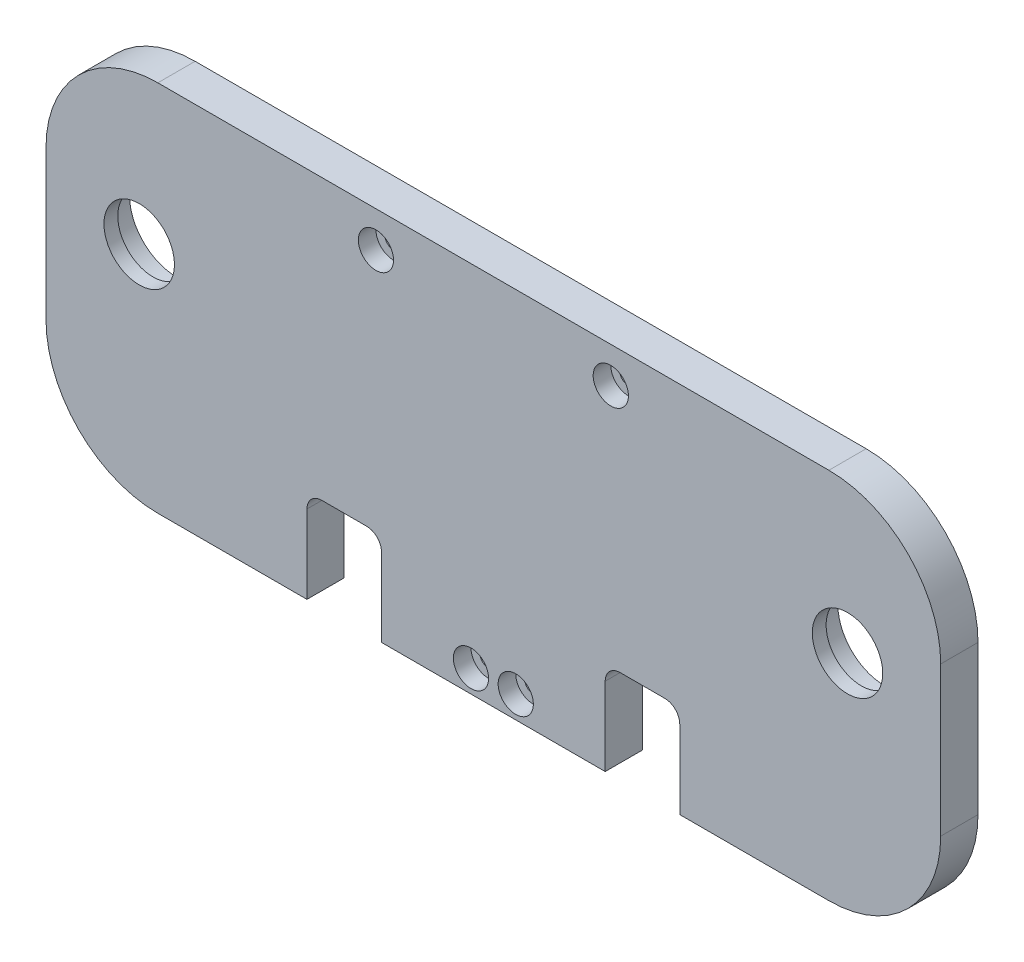
ISO-10303-21;
HEADER;
FILE_DESCRIPTION(('STEP AP214'),'2;1');
FILE_NAME('part.step','',(''),(''),'','','');
FILE_SCHEMA(('AUTOMOTIVE_DESIGN { 1 0 10303 214 1 1 1 1 }'));
ENDSEC;
DATA;
#1=APPLICATION_CONTEXT('core data for automotive mechanical design processes');
#2=APPLICATION_PROTOCOL_DEFINITION('international standard','automotive_design',2000,#1);
#3=PRODUCT_CONTEXT('',#1,'mechanical');
#4=PRODUCT('Part','Part','',(#3));
#5=PRODUCT_RELATED_PRODUCT_CATEGORY('part','',(#4));
#6=PRODUCT_DEFINITION_FORMATION('','',#4);
#7=PRODUCT_DEFINITION_CONTEXT('part definition',#1,'design');
#8=PRODUCT_DEFINITION('design','',#6,#7);
#9=PRODUCT_DEFINITION_SHAPE('','',#8);
#10=(LENGTH_UNIT() NAMED_UNIT(*) SI_UNIT(.MILLI.,.METRE.));
#11=(NAMED_UNIT(*) PLANE_ANGLE_UNIT() SI_UNIT($,.RADIAN.));
#12=(NAMED_UNIT(*) SI_UNIT($,.STERADIAN.) SOLID_ANGLE_UNIT());
#13=UNCERTAINTY_MEASURE_WITH_UNIT(LENGTH_MEASURE(1.E-05),#10,'distance_accuracy_value','');
#14=(GEOMETRIC_REPRESENTATION_CONTEXT(3) GLOBAL_UNCERTAINTY_ASSIGNED_CONTEXT((#13)) GLOBAL_UNIT_ASSIGNED_CONTEXT((#10,
#11,#12)) REPRESENTATION_CONTEXT('',''));
#15=CARTESIAN_POINT('',(0.,0.,0.));
#16=DIRECTION('',(0.,0.,1.));
#17=DIRECTION('',(1.,0.,0.));
#18=AXIS2_PLACEMENT_3D('',#15,#16,#17);
#19=CARTESIAN_POINT('',(-57.15,-31.75,6.35));
#20=DIRECTION('',(0.,1.,0.));
#21=DIRECTION('',(0.,0.,1.));
#22=AXIS2_PLACEMENT_3D('',#19,#20,#21);
#23=PLANE('',#22);
#24=DIRECTION('',(0.,0.,-1.));
#25=VECTOR('',#24,1.);
#26=CARTESIAN_POINT('',(31.75,-31.75,26.6799194538493));
#27=LINE('',#26,#25);
#28=CARTESIAN_POINT('',(31.75,-31.75,6.35));
#29=VERTEX_POINT('',#28);
#30=CARTESIAN_POINT('',(31.75,-31.75,0.));
#31=VERTEX_POINT('',#30);
#32=EDGE_CURVE('E179',#29,#31,#27,.T.);
#33=ORIENTED_EDGE('',*,*,#32,.T.);
#34=DIRECTION('',(1.,0.,0.));
#35=VECTOR('',#34,1.);
#36=CARTESIAN_POINT('',(-57.15,-31.75,0.));
#37=LINE('',#36,#35);
#38=CARTESIAN_POINT('',(57.15,-31.75,0.));
#39=VERTEX_POINT('',#38);
#40=EDGE_CURVE('E189',#31,#39,#37,.T.);
#41=ORIENTED_EDGE('',*,*,#40,.T.);
#42=DIRECTION('',(0.,0.,-1.));
#43=VECTOR('',#42,1.);
#44=CARTESIAN_POINT('',(57.15,-31.75,6.35));
#45=LINE('',#44,#43);
#46=CARTESIAN_POINT('',(57.15,-31.75,6.35));
#47=VERTEX_POINT('',#46);
#48=EDGE_CURVE('E234',#47,#39,#45,.T.);
#49=ORIENTED_EDGE('',*,*,#48,.F.);
#50=DIRECTION('',(1.,0.,0.));
#51=VECTOR('',#50,1.);
#52=CARTESIAN_POINT('',(-57.15,-31.75,6.35));
#53=LINE('',#52,#51);
#54=EDGE_CURVE('E191',#29,#47,#53,.T.);
#55=ORIENTED_EDGE('',*,*,#54,.F.);
#56=EDGE_LOOP('',(#33,#41,#49,#55));
#57=FACE_BOUND('',#56,.T.);
#58=ADVANCED_FACE('F40',(#57),#23,.F.);
#59=DIRECTION('',(0.,0.,-1.));
#60=VECTOR('',#59,1.);
#61=CARTESIAN_POINT('',(19.05,-31.75,26.6799194538493));
#62=LINE('',#61,#60);
#63=CARTESIAN_POINT('',(19.05,-31.75,6.35));
#64=VERTEX_POINT('',#63);
#65=CARTESIAN_POINT('',(19.05,-31.75,0.));
#66=VERTEX_POINT('',#65);
#67=EDGE_CURVE('E192',#64,#66,#62,.T.);
#68=ORIENTED_EDGE('',*,*,#67,.F.);
#69=CARTESIAN_POINT('',(-19.05,-31.75,6.35));
#70=VERTEX_POINT('',#69);
#71=EDGE_CURVE('E439',#70,#64,#53,.T.);
#72=ORIENTED_EDGE('',*,*,#71,.F.);
#73=DIRECTION('',(0.,0.,-1.));
#74=VECTOR('',#73,1.);
#75=CARTESIAN_POINT('',(-19.05,-31.75,26.6799194538493));
#76=LINE('',#75,#74);
#77=CARTESIAN_POINT('',(-19.05,-31.75,0.));
#78=VERTEX_POINT('',#77);
#79=EDGE_CURVE('E372',#70,#78,#76,.T.);
#80=ORIENTED_EDGE('',*,*,#79,.T.);
#81=EDGE_CURVE('E198',#78,#66,#37,.T.);
#82=ORIENTED_EDGE('',*,*,#81,.T.);
#83=EDGE_LOOP('',(#68,#72,#80,#82));
#84=FACE_BOUND('',#83,.T.);
#85=ADVANCED_FACE('F294',(#84),#23,.F.);
#86=CARTESIAN_POINT('',(-57.15,-31.75,0.));
#87=VERTEX_POINT('',#86);
#88=CARTESIAN_POINT('',(-31.75,-31.75,0.));
#89=VERTEX_POINT('',#88);
#90=EDGE_CURVE('E201',#87,#89,#37,.T.);
#91=ORIENTED_EDGE('',*,*,#90,.T.);
#92=DIRECTION('',(0.,0.,-1.));
#93=VECTOR('',#92,1.);
#94=CARTESIAN_POINT('',(-31.75,-31.75,26.6799194538493));
#95=LINE('',#94,#93);
#96=CARTESIAN_POINT('',(-31.75,-31.75,6.35));
#97=VERTEX_POINT('',#96);
#98=EDGE_CURVE('E462',#97,#89,#95,.T.);
#99=ORIENTED_EDGE('',*,*,#98,.F.);
#100=CARTESIAN_POINT('',(-57.15,-31.75,6.35));
#101=VERTEX_POINT('',#100);
#102=EDGE_CURVE('E435',#101,#97,#53,.T.);
#103=ORIENTED_EDGE('',*,*,#102,.F.);
#104=DIRECTION('',(0.,0.,-1.));
#105=VECTOR('',#104,1.);
#106=CARTESIAN_POINT('',(-57.15,-31.75,6.35));
#107=LINE('',#106,#105);
#108=EDGE_CURVE('E236',#101,#87,#107,.T.);
#109=ORIENTED_EDGE('',*,*,#108,.T.);
#110=EDGE_LOOP('',(#91,#99,#103,#109));
#111=FACE_BOUND('',#110,.T.);
#112=ADVANCED_FACE('F296',(#111),#23,.F.);
#113=CARTESIAN_POINT('',(-57.15,12.7,6.35));
#114=DIRECTION('',(0.,0.,-1.));
#115=DIRECTION('',(-1.,0.,0.));
#116=AXIS2_PLACEMENT_3D('',#113,#114,#115);
#117=PLANE('',#116);
#118=CARTESIAN_POINT('',(-60.325,6.35000000000001,6.35));
#119=DIRECTION('',(0.,0.,-1.));
#120=DIRECTION('',(-1.,0.,0.));
#121=AXIS2_PLACEMENT_3D('',#118,#119,#120);
#122=CIRCLE('',#121,5.999999938);
#123=CARTESIAN_POINT('',(-66.324999938,6.35000000000001,6.35));
#124=VERTEX_POINT('',#123);
#125=EDGE_CURVE('E923',#124,#124,#122,.T.);
#126=ORIENTED_EDGE('',*,*,#125,.T.);
#127=EDGE_LOOP('',(#126));
#128=FACE_BOUND('',#127,.T.);
#129=CARTESIAN_POINT('',(60.325,6.35000000000001,6.35));
#130=DIRECTION('',(0.,0.,-1.));
#131=DIRECTION('',(-1.,0.,0.));
#132=AXIS2_PLACEMENT_3D('',#129,#130,#131);
#133=CIRCLE('',#132,5.999999938);
#134=CARTESIAN_POINT('',(54.325000062,6.35000000000001,6.35));
#135=VERTEX_POINT('',#134);
#136=EDGE_CURVE('E470',#135,#135,#133,.T.);
#137=ORIENTED_EDGE('',*,*,#136,.T.);
#138=EDGE_LOOP('',(#137));
#139=FACE_BOUND('',#138,.T.);
#140=CARTESIAN_POINT('',(-3.81,-27.94,6.35));
#141=DIRECTION('',(0.,0.,1.));
#142=DIRECTION('',(1.,0.,0.));
#143=AXIS2_PLACEMENT_3D('',#140,#141,#142);
#144=CIRCLE('',#143,2.999999969);
#145=CARTESIAN_POINT('',(-0.810000030999996,-27.94,6.35));
#146=VERTEX_POINT('',#145);
#147=EDGE_CURVE('E416',#146,#146,#144,.T.);
#148=ORIENTED_EDGE('',*,*,#147,.F.);
#149=EDGE_LOOP('',(#148));
#150=FACE_BOUND('',#149,.T.);
#151=CARTESIAN_POINT('',(3.81,-27.94,6.35));
#152=DIRECTION('',(0.,0.,1.));
#153=DIRECTION('',(1.,0.,0.));
#154=AXIS2_PLACEMENT_3D('',#151,#152,#153);
#155=CIRCLE('',#154,2.999999969);
#156=CARTESIAN_POINT('',(6.809999969,-27.94,6.35));
#157=VERTEX_POINT('',#156);
#158=EDGE_CURVE('E404',#157,#157,#155,.T.);
#159=ORIENTED_EDGE('',*,*,#158,.F.);
#160=EDGE_LOOP('',(#159));
#161=FACE_BOUND('',#160,.T.);
#162=CARTESIAN_POINT('',(20.,25.65,6.35));
#163=DIRECTION('',(0.,0.,1.));
#164=DIRECTION('',(1.,0.,0.));
#165=AXIS2_PLACEMENT_3D('',#162,#163,#164);
#166=CIRCLE('',#165,2.999999969);
#167=CARTESIAN_POINT('',(22.999999969,25.65,6.35));
#168=VERTEX_POINT('',#167);
#169=EDGE_CURVE('E392',#168,#168,#166,.T.);
#170=ORIENTED_EDGE('',*,*,#169,.F.);
#171=EDGE_LOOP('',(#170));
#172=FACE_BOUND('',#171,.T.);
#173=CARTESIAN_POINT('',(-20.,25.65,6.35));
#174=DIRECTION('',(0.,0.,1.));
#175=DIRECTION('',(1.,0.,0.));
#176=AXIS2_PLACEMENT_3D('',#173,#174,#175);
#177=CIRCLE('',#176,2.999999969);
#178=CARTESIAN_POINT('',(-17.000000031,25.65,6.35));
#179=VERTEX_POINT('',#178);
#180=EDGE_CURVE('E379',#179,#179,#177,.T.);
#181=ORIENTED_EDGE('',*,*,#180,.F.);
#182=EDGE_LOOP('',(#181));
#183=FACE_BOUND('',#182,.T.);
#184=DIRECTION('',(1.,0.,0.));
#185=VECTOR('',#184,1.);
#186=CARTESIAN_POINT('',(0.,-15.875,6.35));
#187=LINE('',#186,#185);
#188=CARTESIAN_POINT('',(21.59,-15.875,6.35));
#189=VERTEX_POINT('',#188);
#190=CARTESIAN_POINT('',(29.21,-15.875,6.35));
#191=VERTEX_POINT('',#190);
#192=EDGE_CURVE('E383',#189,#191,#187,.T.);
#193=ORIENTED_EDGE('',*,*,#192,.T.);
#194=CARTESIAN_POINT('',(29.21,-18.415,6.35));
#195=DIRECTION('',(0.,0.,-1.));
#196=DIRECTION('',(-1.,0.,0.));
#197=AXIS2_PLACEMENT_3D('',#194,#195,#196);
#198=CIRCLE('',#197,2.54);
#199=CARTESIAN_POINT('',(31.75,-18.415,6.35));
#200=VERTEX_POINT('',#199);
#201=EDGE_CURVE('E11',#191,#200,#198,.T.);
#202=ORIENTED_EDGE('',*,*,#201,.T.);
#203=DIRECTION('',(0.,-1.,0.));
#204=VECTOR('',#203,1.);
#205=CARTESIAN_POINT('',(31.75,0.,6.35));
#206=LINE('',#205,#204);
#207=EDGE_CURVE('E469',#200,#29,#206,.T.);
#208=ORIENTED_EDGE('',*,*,#207,.T.);
#209=ORIENTED_EDGE('',*,*,#54,.T.);
#210=CARTESIAN_POINT('',(57.15,-12.7,6.35));
#211=DIRECTION('',(0.,0.,1.));
#212=DIRECTION('',(-1.,0.,0.));
#213=AXIS2_PLACEMENT_3D('',#210,#211,#212);
#214=CIRCLE('',#213,19.05);
#215=CARTESIAN_POINT('',(76.2,-12.7,6.35));
#216=VERTEX_POINT('',#215);
#217=EDGE_CURVE('E438',#47,#216,#214,.T.);
#218=ORIENTED_EDGE('',*,*,#217,.T.);
#219=DIRECTION('',(0.,1.,0.));
#220=VECTOR('',#219,1.);
#221=CARTESIAN_POINT('',(76.2,12.7,6.35));
#222=LINE('',#221,#220);
#223=CARTESIAN_POINT('',(76.2,12.7,6.35));
#224=VERTEX_POINT('',#223);
#225=EDGE_CURVE('E441',#216,#224,#222,.T.);
#226=ORIENTED_EDGE('',*,*,#225,.T.);
#227=CARTESIAN_POINT('',(57.15,12.7,6.35));
#228=DIRECTION('',(0.,0.,1.));
#229=DIRECTION('',(-1.,0.,0.));
#230=AXIS2_PLACEMENT_3D('',#227,#228,#229);
#231=CIRCLE('',#230,19.05);
#232=CARTESIAN_POINT('',(57.15,31.75,6.35));
#233=VERTEX_POINT('',#232);
#234=EDGE_CURVE('E443',#224,#233,#231,.T.);
#235=ORIENTED_EDGE('',*,*,#234,.T.);
#236=DIRECTION('',(-1.,0.,0.));
#237=VECTOR('',#236,1.);
#238=CARTESIAN_POINT('',(-57.15,31.75,6.35));
#239=LINE('',#238,#237);
#240=CARTESIAN_POINT('',(-57.15,31.75,6.35));
#241=VERTEX_POINT('',#240);
#242=EDGE_CURVE('E226',#233,#241,#239,.T.);
#243=ORIENTED_EDGE('',*,*,#242,.T.);
#244=CARTESIAN_POINT('',(-57.15,12.7,6.35));
#245=DIRECTION('',(0.,0.,1.));
#246=DIRECTION('',(-1.,0.,0.));
#247=AXIS2_PLACEMENT_3D('',#244,#245,#246);
#248=CIRCLE('',#247,19.05);
#249=CARTESIAN_POINT('',(-76.2,12.7,6.35));
#250=VERTEX_POINT('',#249);
#251=EDGE_CURVE('E221',#241,#250,#248,.T.);
#252=ORIENTED_EDGE('',*,*,#251,.T.);
#253=DIRECTION('',(0.,-1.,0.));
#254=VECTOR('',#253,1.);
#255=CARTESIAN_POINT('',(-76.2,12.7,6.35));
#256=LINE('',#255,#254);
#257=CARTESIAN_POINT('',(-76.2,-12.7,6.35));
#258=VERTEX_POINT('',#257);
#259=EDGE_CURVE('E431',#250,#258,#256,.T.);
#260=ORIENTED_EDGE('',*,*,#259,.T.);
#261=CARTESIAN_POINT('',(-57.15,-12.7,6.35));
#262=DIRECTION('',(0.,0.,1.));
#263=DIRECTION('',(-1.,0.,0.));
#264=AXIS2_PLACEMENT_3D('',#261,#262,#263);
#265=CIRCLE('',#264,19.05);
#266=EDGE_CURVE('E433',#258,#101,#265,.T.);
#267=ORIENTED_EDGE('',*,*,#266,.T.);
#268=ORIENTED_EDGE('',*,*,#102,.T.);
#269=DIRECTION('',(0.,-1.,0.));
#270=VECTOR('',#269,1.);
#271=CARTESIAN_POINT('',(-31.75,0.,6.35));
#272=LINE('',#271,#270);
#273=CARTESIAN_POINT('',(-31.75,-18.415,6.35));
#274=VERTEX_POINT('',#273);
#275=EDGE_CURVE('E374',#274,#97,#272,.T.);
#276=ORIENTED_EDGE('',*,*,#275,.F.);
#277=CARTESIAN_POINT('',(-29.21,-18.415,6.35));
#278=DIRECTION('',(0.,0.,-1.));
#279=DIRECTION('',(-1.,0.,0.));
#280=AXIS2_PLACEMENT_3D('',#277,#278,#279);
#281=CIRCLE('',#280,2.54);
#282=CARTESIAN_POINT('',(-29.21,-15.875,6.35));
#283=VERTEX_POINT('',#282);
#284=EDGE_CURVE('E264',#274,#283,#281,.T.);
#285=ORIENTED_EDGE('',*,*,#284,.T.);
#286=DIRECTION('',(1.,0.,0.));
#287=VECTOR('',#286,1.);
#288=CARTESIAN_POINT('',(0.,-15.875,6.35));
#289=LINE('',#288,#287);
#290=CARTESIAN_POINT('',(-21.59,-15.875,6.35));
#291=VERTEX_POINT('',#290);
#292=EDGE_CURVE('E367',#283,#291,#289,.T.);
#293=ORIENTED_EDGE('',*,*,#292,.T.);
#294=CARTESIAN_POINT('',(-21.59,-18.415,6.35));
#295=DIRECTION('',(0.,0.,-1.));
#296=DIRECTION('',(-1.,0.,0.));
#297=AXIS2_PLACEMENT_3D('',#294,#295,#296);
#298=CIRCLE('',#297,2.54);
#299=CARTESIAN_POINT('',(-19.05,-18.415,6.35));
#300=VERTEX_POINT('',#299);
#301=EDGE_CURVE('E268',#291,#300,#298,.T.);
#302=ORIENTED_EDGE('',*,*,#301,.T.);
#303=DIRECTION('',(0.,1.,0.));
#304=VECTOR('',#303,1.);
#305=CARTESIAN_POINT('',(-19.05,0.,6.35));
#306=LINE('',#305,#304);
#307=EDGE_CURVE('E279',#70,#300,#306,.T.);
#308=ORIENTED_EDGE('',*,*,#307,.F.);
#309=ORIENTED_EDGE('',*,*,#71,.T.);
#310=DIRECTION('',(0.,1.,0.));
#311=VECTOR('',#310,1.);
#312=CARTESIAN_POINT('',(19.05,0.,6.35));
#313=LINE('',#312,#311);
#314=CARTESIAN_POINT('',(19.05,-18.415,6.35));
#315=VERTEX_POINT('',#314);
#316=EDGE_CURVE('E481',#64,#315,#313,.T.);
#317=ORIENTED_EDGE('',*,*,#316,.T.);
#318=CARTESIAN_POINT('',(21.59,-18.415,6.35));
#319=DIRECTION('',(0.,0.,-1.));
#320=DIRECTION('',(-1.,0.,0.));
#321=AXIS2_PLACEMENT_3D('',#318,#319,#320);
#322=CIRCLE('',#321,2.54);
#323=EDGE_CURVE('E272',#315,#189,#322,.T.);
#324=ORIENTED_EDGE('',*,*,#323,.T.);
#325=EDGE_LOOP('',(#193,#202,#208,#209,#218,#226,#235,#243,#252,#260,#267,#268,#276,#285,#293,
#302,#308,#309,#317,#324));
#326=FACE_BOUND('',#325,.T.);
#327=ADVANCED_FACE('F304',(#128,#139,#150,#161,#172,#183,#326),#117,.F.);
#328=CARTESIAN_POINT('',(-57.15,12.7,0.));
#329=DIRECTION('',(0.,0.,-1.));
#330=DIRECTION('',(-1.,0.,0.));
#331=AXIS2_PLACEMENT_3D('',#328,#329,#330);
#332=PLANE('',#331);
#333=CARTESIAN_POINT('',(-60.325,6.35000000000001,0.));
#334=DIRECTION('',(0.,0.,-1.));
#335=DIRECTION('',(-1.,0.,0.));
#336=AXIS2_PLACEMENT_3D('',#333,#334,#335);
#337=CIRCLE('',#336,8.00000000199999);
#338=CARTESIAN_POINT('',(-68.325000002,6.35000000000001,0.));
#339=VERTEX_POINT('',#338);
#340=EDGE_CURVE('E916',#339,#339,#337,.T.);
#341=ORIENTED_EDGE('',*,*,#340,.F.);
#342=EDGE_LOOP('',(#341));
#343=FACE_BOUND('',#342,.T.);
#344=CARTESIAN_POINT('',(60.325,6.35000000000001,0.));
#345=DIRECTION('',(0.,0.,-1.));
#346=DIRECTION('',(-1.,0.,0.));
#347=AXIS2_PLACEMENT_3D('',#344,#345,#346);
#348=CIRCLE('',#347,8.00000000199999);
#349=CARTESIAN_POINT('',(52.324999998,6.35000000000001,0.));
#350=VERTEX_POINT('',#349);
#351=EDGE_CURVE('E925',#350,#350,#348,.T.);
#352=ORIENTED_EDGE('',*,*,#351,.F.);
#353=EDGE_LOOP('',(#352));
#354=FACE_BOUND('',#353,.T.);
#355=CARTESIAN_POINT('',(-20.,25.65,0.));
#356=DIRECTION('',(0.,0.,1.));
#357=DIRECTION('',(1.,0.,0.));
#358=AXIS2_PLACEMENT_3D('',#355,#356,#357);
#359=CIRCLE('',#358,1.500000048);
#360=CARTESIAN_POINT('',(-18.499999952,25.65,0.));
#361=VERTEX_POINT('',#360);
#362=EDGE_CURVE('E389',#361,#361,#359,.T.);
#363=ORIENTED_EDGE('',*,*,#362,.T.);
#364=EDGE_LOOP('',(#363));
#365=FACE_BOUND('',#364,.T.);
#366=CARTESIAN_POINT('',(20.,25.65,0.));
#367=DIRECTION('',(0.,0.,1.));
#368=DIRECTION('',(1.,0.,0.));
#369=AXIS2_PLACEMENT_3D('',#366,#367,#368);
#370=CIRCLE('',#369,1.500000048);
#371=CARTESIAN_POINT('',(21.500000048,25.65,0.));
#372=VERTEX_POINT('',#371);
#373=EDGE_CURVE('E401',#372,#372,#370,.T.);
#374=ORIENTED_EDGE('',*,*,#373,.T.);
#375=EDGE_LOOP('',(#374));
#376=FACE_BOUND('',#375,.T.);
#377=CARTESIAN_POINT('',(3.81,-27.94,0.));
#378=DIRECTION('',(0.,0.,1.));
#379=DIRECTION('',(1.,0.,0.));
#380=AXIS2_PLACEMENT_3D('',#377,#378,#379);
#381=CIRCLE('',#380,1.500000048);
#382=CARTESIAN_POINT('',(5.310000048,-27.94,0.));
#383=VERTEX_POINT('',#382);
#384=EDGE_CURVE('E413',#383,#383,#381,.T.);
#385=ORIENTED_EDGE('',*,*,#384,.T.);
#386=EDGE_LOOP('',(#385));
#387=FACE_BOUND('',#386,.T.);
#388=CARTESIAN_POINT('',(-3.81,-27.94,0.));
#389=DIRECTION('',(0.,0.,1.));
#390=DIRECTION('',(1.,0.,0.));
#391=AXIS2_PLACEMENT_3D('',#388,#389,#390);
#392=CIRCLE('',#391,1.500000048);
#393=CARTESIAN_POINT('',(-2.309999952,-27.94,0.));
#394=VERTEX_POINT('',#393);
#395=EDGE_CURVE('E425',#394,#394,#392,.T.);
#396=ORIENTED_EDGE('',*,*,#395,.T.);
#397=EDGE_LOOP('',(#396));
#398=FACE_BOUND('',#397,.T.);
#399=ORIENTED_EDGE('',*,*,#40,.F.);
#400=DIRECTION('',(0.,1.,0.));
#401=VECTOR('',#400,1.);
#402=CARTESIAN_POINT('',(31.75,0.,0.));
#403=LINE('',#402,#401);
#404=CARTESIAN_POINT('',(31.75,-18.415,0.));
#405=VERTEX_POINT('',#404);
#406=EDGE_CURVE('E176',#31,#405,#403,.T.);
#407=ORIENTED_EDGE('',*,*,#406,.T.);
#408=CARTESIAN_POINT('',(29.21,-18.415,0.));
#409=DIRECTION('',(0.,0.,-1.));
#410=DIRECTION('',(-1.,0.,0.));
#411=AXIS2_PLACEMENT_3D('',#408,#409,#410);
#412=CIRCLE('',#411,2.54);
#413=CARTESIAN_POINT('',(29.21,-15.875,0.));
#414=VERTEX_POINT('',#413);
#415=EDGE_CURVE('E48',#405,#414,#412,.F.);
#416=ORIENTED_EDGE('',*,*,#415,.T.);
#417=DIRECTION('',(-1.,0.,0.));
#418=VECTOR('',#417,1.);
#419=CARTESIAN_POINT('',(0.,-15.875,0.));
#420=LINE('',#419,#418);
#421=CARTESIAN_POINT('',(21.59,-15.875,0.));
#422=VERTEX_POINT('',#421);
#423=EDGE_CURVE('E185',#414,#422,#420,.T.);
#424=ORIENTED_EDGE('',*,*,#423,.T.);
#425=CARTESIAN_POINT('',(21.59,-18.415,0.));
#426=DIRECTION('',(0.,0.,-1.));
#427=DIRECTION('',(-1.,0.,0.));
#428=AXIS2_PLACEMENT_3D('',#425,#426,#427);
#429=CIRCLE('',#428,2.54);
#430=CARTESIAN_POINT('',(19.05,-18.415,0.));
#431=VERTEX_POINT('',#430);
#432=EDGE_CURVE('E270',#422,#431,#429,.F.);
#433=ORIENTED_EDGE('',*,*,#432,.T.);
#434=DIRECTION('',(0.,-1.,0.));
#435=VECTOR('',#434,1.);
#436=CARTESIAN_POINT('',(19.05,0.,0.));
#437=LINE('',#436,#435);
#438=EDGE_CURVE('E184',#431,#66,#437,.T.);
#439=ORIENTED_EDGE('',*,*,#438,.T.);
#440=ORIENTED_EDGE('',*,*,#81,.F.);
#441=DIRECTION('',(0.,-1.,0.));
#442=VECTOR('',#441,1.);
#443=CARTESIAN_POINT('',(-19.05,0.,0.));
#444=LINE('',#443,#442);
#445=CARTESIAN_POINT('',(-19.05,-18.415,0.));
#446=VERTEX_POINT('',#445);
#447=EDGE_CURVE('E460',#446,#78,#444,.T.);
#448=ORIENTED_EDGE('',*,*,#447,.F.);
#449=CARTESIAN_POINT('',(-21.59,-18.415,0.));
#450=DIRECTION('',(0.,0.,-1.));
#451=DIRECTION('',(-1.,0.,0.));
#452=AXIS2_PLACEMENT_3D('',#449,#450,#451);
#453=CIRCLE('',#452,2.54);
#454=CARTESIAN_POINT('',(-21.59,-15.875,0.));
#455=VERTEX_POINT('',#454);
#456=EDGE_CURVE('E266',#446,#455,#453,.F.);
#457=ORIENTED_EDGE('',*,*,#456,.T.);
#458=DIRECTION('',(-1.,0.,0.));
#459=VECTOR('',#458,1.);
#460=CARTESIAN_POINT('',(0.,-15.875,0.));
#461=LINE('',#460,#459);
#462=CARTESIAN_POINT('',(-29.21,-15.875,0.));
#463=VERTEX_POINT('',#462);
#464=EDGE_CURVE('E463',#455,#463,#461,.T.);
#465=ORIENTED_EDGE('',*,*,#464,.T.);
#466=CARTESIAN_POINT('',(-29.21,-18.415,0.));
#467=DIRECTION('',(0.,0.,-1.));
#468=DIRECTION('',(-1.,0.,0.));
#469=AXIS2_PLACEMENT_3D('',#466,#467,#468);
#470=CIRCLE('',#469,2.54);
#471=CARTESIAN_POINT('',(-31.75,-18.415,0.));
#472=VERTEX_POINT('',#471);
#473=EDGE_CURVE('E262',#463,#472,#470,.F.);
#474=ORIENTED_EDGE('',*,*,#473,.T.);
#475=DIRECTION('',(0.,1.,0.));
#476=VECTOR('',#475,1.);
#477=CARTESIAN_POINT('',(-31.75,0.,0.));
#478=LINE('',#477,#476);
#479=EDGE_CURVE('E456',#89,#472,#478,.T.);
#480=ORIENTED_EDGE('',*,*,#479,.F.);
#481=ORIENTED_EDGE('',*,*,#90,.F.);
#482=CARTESIAN_POINT('',(-57.15,-12.7,0.));
#483=DIRECTION('',(0.,0.,1.));
#484=DIRECTION('',(-1.,0.,0.));
#485=AXIS2_PLACEMENT_3D('',#482,#483,#484);
#486=CIRCLE('',#485,19.05);
#487=CARTESIAN_POINT('',(-76.2,-12.7,0.));
#488=VERTEX_POINT('',#487);
#489=EDGE_CURVE('E199',#488,#87,#486,.T.);
#490=ORIENTED_EDGE('',*,*,#489,.F.);
#491=DIRECTION('',(0.,-1.,0.));
#492=VECTOR('',#491,1.);
#493=CARTESIAN_POINT('',(-76.2,12.7,0.));
#494=LINE('',#493,#492);
#495=CARTESIAN_POINT('',(-76.2,12.7,0.));
#496=VERTEX_POINT('',#495);
#497=EDGE_CURVE('E203',#496,#488,#494,.T.);
#498=ORIENTED_EDGE('',*,*,#497,.F.);
#499=CARTESIAN_POINT('',(-57.15,12.7,0.));
#500=DIRECTION('',(0.,0.,1.));
#501=DIRECTION('',(-1.,0.,0.));
#502=AXIS2_PLACEMENT_3D('',#499,#500,#501);
#503=CIRCLE('',#502,19.05);
#504=CARTESIAN_POINT('',(-57.15,31.75,0.));
#505=VERTEX_POINT('',#504);
#506=EDGE_CURVE('E428',#505,#496,#503,.T.);
#507=ORIENTED_EDGE('',*,*,#506,.F.);
#508=DIRECTION('',(-1.,0.,0.));
#509=VECTOR('',#508,1.);
#510=CARTESIAN_POINT('',(-57.15,31.75,0.));
#511=LINE('',#510,#509);
#512=CARTESIAN_POINT('',(57.15,31.75,0.));
#513=VERTEX_POINT('',#512);
#514=EDGE_CURVE('E219',#513,#505,#511,.T.);
#515=ORIENTED_EDGE('',*,*,#514,.F.);
#516=CARTESIAN_POINT('',(57.15,12.7,0.));
#517=DIRECTION('',(0.,0.,1.));
#518=DIRECTION('',(-1.,0.,0.));
#519=AXIS2_PLACEMENT_3D('',#516,#517,#518);
#520=CIRCLE('',#519,19.05);
#521=CARTESIAN_POINT('',(76.2,12.7,0.));
#522=VERTEX_POINT('',#521);
#523=EDGE_CURVE('E215',#522,#513,#520,.T.);
#524=ORIENTED_EDGE('',*,*,#523,.F.);
#525=DIRECTION('',(0.,1.,0.));
#526=VECTOR('',#525,1.);
#527=CARTESIAN_POINT('',(76.2,12.7,0.));
#528=LINE('',#527,#526);
#529=CARTESIAN_POINT('',(76.2,-12.7,0.));
#530=VERTEX_POINT('',#529);
#531=EDGE_CURVE('E211',#530,#522,#528,.T.);
#532=ORIENTED_EDGE('',*,*,#531,.F.);
#533=CARTESIAN_POINT('',(57.15,-12.7,0.));
#534=DIRECTION('',(0.,0.,1.));
#535=DIRECTION('',(-1.,0.,0.));
#536=AXIS2_PLACEMENT_3D('',#533,#534,#535);
#537=CIRCLE('',#536,19.05);
#538=EDGE_CURVE('E197',#39,#530,#537,.T.);
#539=ORIENTED_EDGE('',*,*,#538,.F.);
#540=EDGE_LOOP('',(#399,#407,#416,#424,#433,#439,#440,#448,#457,#465,#474,#480,#481,#490,#498,
#507,#515,#524,#532,#539));
#541=FACE_BOUND('',#540,.T.);
#542=ADVANCED_FACE('F195',(#343,#354,#365,#376,#387,#398,#541),#332,.T.);
#543=CARTESIAN_POINT('',(-57.15,12.7,6.35));
#544=DIRECTION('',(0.,0.,-1.));
#545=DIRECTION('',(-1.,0.,0.));
#546=AXIS2_PLACEMENT_3D('',#543,#544,#545);
#547=CYLINDRICAL_SURFACE('',#546,19.05);
#548=ORIENTED_EDGE('',*,*,#506,.T.);
#549=DIRECTION('',(0.,0.,-1.));
#550=VECTOR('',#549,1.);
#551=CARTESIAN_POINT('',(-76.2,12.7,6.35));
#552=LINE('',#551,#550);
#553=EDGE_CURVE('E241',#250,#496,#552,.T.);
#554=ORIENTED_EDGE('',*,*,#553,.F.);
#555=ORIENTED_EDGE('',*,*,#251,.F.);
#556=DIRECTION('',(0.,0.,-1.));
#557=VECTOR('',#556,1.);
#558=CARTESIAN_POINT('',(-57.15,31.75,6.35));
#559=LINE('',#558,#557);
#560=EDGE_CURVE('E222',#241,#505,#559,.T.);
#561=ORIENTED_EDGE('',*,*,#560,.T.);
#562=EDGE_LOOP('',(#548,#554,#555,#561));
#563=FACE_BOUND('',#562,.T.);
#564=ADVANCED_FACE('F313',(#563),#547,.T.);
#565=CARTESIAN_POINT('',(-76.2,12.7,6.35));
#566=DIRECTION('',(1.,0.,0.));
#567=DIRECTION('',(0.,0.,-1.));
#568=AXIS2_PLACEMENT_3D('',#565,#566,#567);
#569=PLANE('',#568);
#570=ORIENTED_EDGE('',*,*,#497,.T.);
#571=DIRECTION('',(0.,0.,-1.));
#572=VECTOR('',#571,1.);
#573=CARTESIAN_POINT('',(-76.2,-12.7,6.35));
#574=LINE('',#573,#572);
#575=EDGE_CURVE('E238',#258,#488,#574,.T.);
#576=ORIENTED_EDGE('',*,*,#575,.F.);
#577=ORIENTED_EDGE('',*,*,#259,.F.);
#578=ORIENTED_EDGE('',*,*,#553,.T.);
#579=EDGE_LOOP('',(#570,#576,#577,#578));
#580=FACE_BOUND('',#579,.T.);
#581=ADVANCED_FACE('F339',(#580),#569,.F.);
#582=CARTESIAN_POINT('',(-57.15,-12.7,6.35));
#583=DIRECTION('',(0.,0.,-1.));
#584=DIRECTION('',(-1.,0.,0.));
#585=AXIS2_PLACEMENT_3D('',#582,#583,#584);
#586=CYLINDRICAL_SURFACE('',#585,19.05);
#587=ORIENTED_EDGE('',*,*,#489,.T.);
#588=ORIENTED_EDGE('',*,*,#108,.F.);
#589=ORIENTED_EDGE('',*,*,#266,.F.);
#590=ORIENTED_EDGE('',*,*,#575,.T.);
#591=EDGE_LOOP('',(#587,#588,#589,#590));
#592=FACE_BOUND('',#591,.T.);
#593=ADVANCED_FACE('F335',(#592),#586,.T.);
#594=CARTESIAN_POINT('',(57.15,-12.7,6.35));
#595=DIRECTION('',(0.,0.,-1.));
#596=DIRECTION('',(-1.,0.,0.));
#597=AXIS2_PLACEMENT_3D('',#594,#595,#596);
#598=CYLINDRICAL_SURFACE('',#597,19.05);
#599=ORIENTED_EDGE('',*,*,#538,.T.);
#600=DIRECTION('',(0.,0.,-1.));
#601=VECTOR('',#600,1.);
#602=CARTESIAN_POINT('',(76.2,-12.7,6.35));
#603=LINE('',#602,#601);
#604=EDGE_CURVE('E232',#216,#530,#603,.T.);
#605=ORIENTED_EDGE('',*,*,#604,.F.);
#606=ORIENTED_EDGE('',*,*,#217,.F.);
#607=ORIENTED_EDGE('',*,*,#48,.T.);
#608=EDGE_LOOP('',(#599,#605,#606,#607));
#609=FACE_BOUND('',#608,.T.);
#610=ADVANCED_FACE('F332',(#609),#598,.T.);
#611=CARTESIAN_POINT('',(76.2,12.7,6.35));
#612=DIRECTION('',(-1.,0.,0.));
#613=DIRECTION('',(0.,0.,1.));
#614=AXIS2_PLACEMENT_3D('',#611,#612,#613);
#615=PLANE('',#614);
#616=ORIENTED_EDGE('',*,*,#531,.T.);
#617=DIRECTION('',(0.,0.,-1.));
#618=VECTOR('',#617,1.);
#619=CARTESIAN_POINT('',(76.2,12.7,6.35));
#620=LINE('',#619,#618);
#621=EDGE_CURVE('E229',#224,#522,#620,.T.);
#622=ORIENTED_EDGE('',*,*,#621,.F.);
#623=ORIENTED_EDGE('',*,*,#225,.F.);
#624=ORIENTED_EDGE('',*,*,#604,.T.);
#625=EDGE_LOOP('',(#616,#622,#623,#624));
#626=FACE_BOUND('',#625,.T.);
#627=ADVANCED_FACE('F329',(#626),#615,.F.);
#628=CARTESIAN_POINT('',(57.15,12.7,6.35));
#629=DIRECTION('',(0.,0.,-1.));
#630=DIRECTION('',(-1.,0.,0.));
#631=AXIS2_PLACEMENT_3D('',#628,#629,#630);
#632=CYLINDRICAL_SURFACE('',#631,19.05);
#633=ORIENTED_EDGE('',*,*,#523,.T.);
#634=DIRECTION('',(0.,0.,-1.));
#635=VECTOR('',#634,1.);
#636=CARTESIAN_POINT('',(57.15,31.75,6.35));
#637=LINE('',#636,#635);
#638=EDGE_CURVE('E225',#233,#513,#637,.T.);
#639=ORIENTED_EDGE('',*,*,#638,.F.);
#640=ORIENTED_EDGE('',*,*,#234,.F.);
#641=ORIENTED_EDGE('',*,*,#621,.T.);
#642=EDGE_LOOP('',(#633,#639,#640,#641));
#643=FACE_BOUND('',#642,.T.);
#644=ADVANCED_FACE('F325',(#643),#632,.T.);
#645=CARTESIAN_POINT('',(-57.15,31.75,6.35));
#646=DIRECTION('',(0.,-1.,0.));
#647=DIRECTION('',(0.,0.,-1.));
#648=AXIS2_PLACEMENT_3D('',#645,#646,#647);
#649=PLANE('',#648);
#650=ORIENTED_EDGE('',*,*,#514,.T.);
#651=ORIENTED_EDGE('',*,*,#560,.F.);
#652=ORIENTED_EDGE('',*,*,#242,.F.);
#653=ORIENTED_EDGE('',*,*,#638,.T.);
#654=EDGE_LOOP('',(#650,#651,#652,#653));
#655=FACE_BOUND('',#654,.T.);
#656=ADVANCED_FACE('F322',(#655),#649,.F.);
#657=CARTESIAN_POINT('',(-3.81,-27.94,6.35));
#658=DIRECTION('',(0.,0.,1.));
#659=DIRECTION('',(1.,0.,0.));
#660=AXIS2_PLACEMENT_3D('',#657,#658,#659);
#661=CYLINDRICAL_SURFACE('',#660,1.500000048);
#662=ORIENTED_EDGE('',*,*,#395,.F.);
#663=EDGE_LOOP('',(#662));
#664=FACE_BOUND('',#663,.T.);
#665=CARTESIAN_POINT('',(-3.81,-27.94,3.349999904));
#666=DIRECTION('',(0.,0.,1.));
#667=DIRECTION('',(1.,0.,0.));
#668=AXIS2_PLACEMENT_3D('',#665,#666,#667);
#669=CIRCLE('',#668,1.500000048);
#670=CARTESIAN_POINT('',(-2.309999952,-27.94,3.349999904));
#671=VERTEX_POINT('',#670);
#672=EDGE_CURVE('E422',#671,#671,#669,.T.);
#673=ORIENTED_EDGE('',*,*,#672,.T.);
#674=EDGE_LOOP('',(#673));
#675=FACE_BOUND('',#674,.T.);
#676=ADVANCED_FACE('F319',(#664,#675),#661,.F.);
#677=CARTESIAN_POINT('',(-2.309999952,-27.94,3.349999904));
#678=DIRECTION('',(0.,0.,-1.));
#679=DIRECTION('',(-1.,0.,0.));
#680=AXIS2_PLACEMENT_3D('',#677,#678,#679);
#681=PLANE('',#680);
#682=ORIENTED_EDGE('',*,*,#672,.F.);
#683=EDGE_LOOP('',(#682));
#684=FACE_BOUND('',#683,.T.);
#685=CARTESIAN_POINT('',(-3.81,-27.94,3.349999904));
#686=DIRECTION('',(0.,0.,1.));
#687=DIRECTION('',(1.,0.,0.));
#688=AXIS2_PLACEMENT_3D('',#685,#686,#687);
#689=CIRCLE('',#688,2.999999969);
#690=CARTESIAN_POINT('',(-0.810000030999997,-27.94,3.349999904));
#691=VERTEX_POINT('',#690);
#692=EDGE_CURVE('E419',#691,#691,#689,.T.);
#693=ORIENTED_EDGE('',*,*,#692,.T.);
#694=EDGE_LOOP('',(#693));
#695=FACE_BOUND('',#694,.T.);
#696=ADVANCED_FACE('F552',(#684,#695),#681,.F.);
#697=CARTESIAN_POINT('',(-3.81,-27.94,6.35));
#698=DIRECTION('',(0.,0.,1.));
#699=DIRECTION('',(1.,0.,0.));
#700=AXIS2_PLACEMENT_3D('',#697,#698,#699);
#701=CYLINDRICAL_SURFACE('',#700,2.999999969);
#702=ORIENTED_EDGE('',*,*,#692,.F.);
#703=EDGE_LOOP('',(#702));
#704=FACE_BOUND('',#703,.T.);
#705=ORIENTED_EDGE('',*,*,#147,.T.);
#706=EDGE_LOOP('',(#705));
#707=FACE_BOUND('',#706,.T.);
#708=ADVANCED_FACE('F549',(#704,#707),#701,.F.);
#709=CARTESIAN_POINT('',(3.81,-27.94,6.35));
#710=DIRECTION('',(0.,0.,1.));
#711=DIRECTION('',(1.,0.,0.));
#712=AXIS2_PLACEMENT_3D('',#709,#710,#711);
#713=CYLINDRICAL_SURFACE('',#712,1.500000048);
#714=ORIENTED_EDGE('',*,*,#384,.F.);
#715=EDGE_LOOP('',(#714));
#716=FACE_BOUND('',#715,.T.);
#717=CARTESIAN_POINT('',(3.81,-27.94,3.349999904));
#718=DIRECTION('',(0.,0.,1.));
#719=DIRECTION('',(1.,0.,0.));
#720=AXIS2_PLACEMENT_3D('',#717,#718,#719);
#721=CIRCLE('',#720,1.500000048);
#722=CARTESIAN_POINT('',(5.310000048,-27.94,3.349999904));
#723=VERTEX_POINT('',#722);
#724=EDGE_CURVE('E410',#723,#723,#721,.T.);
#725=ORIENTED_EDGE('',*,*,#724,.T.);
#726=EDGE_LOOP('',(#725));
#727=FACE_BOUND('',#726,.T.);
#728=ADVANCED_FACE('F545',(#716,#727),#713,.F.);
#729=CARTESIAN_POINT('',(5.310000048,-27.94,3.349999904));
#730=DIRECTION('',(0.,0.,-1.));
#731=DIRECTION('',(-1.,0.,0.));
#732=AXIS2_PLACEMENT_3D('',#729,#730,#731);
#733=PLANE('',#732);
#734=ORIENTED_EDGE('',*,*,#724,.F.);
#735=EDGE_LOOP('',(#734));
#736=FACE_BOUND('',#735,.T.);
#737=CARTESIAN_POINT('',(3.81,-27.94,3.349999904));
#738=DIRECTION('',(0.,0.,1.));
#739=DIRECTION('',(1.,0.,0.));
#740=AXIS2_PLACEMENT_3D('',#737,#738,#739);
#741=CIRCLE('',#740,2.999999969);
#742=CARTESIAN_POINT('',(6.809999969,-27.94,3.349999904));
#743=VERTEX_POINT('',#742);
#744=EDGE_CURVE('E407',#743,#743,#741,.T.);
#745=ORIENTED_EDGE('',*,*,#744,.T.);
#746=EDGE_LOOP('',(#745));
#747=FACE_BOUND('',#746,.T.);
#748=ADVANCED_FACE('F541',(#736,#747),#733,.F.);
#749=CARTESIAN_POINT('',(3.81,-27.94,6.35));
#750=DIRECTION('',(0.,0.,1.));
#751=DIRECTION('',(1.,0.,0.));
#752=AXIS2_PLACEMENT_3D('',#749,#750,#751);
#753=CYLINDRICAL_SURFACE('',#752,2.999999969);
#754=ORIENTED_EDGE('',*,*,#744,.F.);
#755=EDGE_LOOP('',(#754));
#756=FACE_BOUND('',#755,.T.);
#757=ORIENTED_EDGE('',*,*,#158,.T.);
#758=EDGE_LOOP('',(#757));
#759=FACE_BOUND('',#758,.T.);
#760=ADVANCED_FACE('F537',(#756,#759),#753,.F.);
#761=CARTESIAN_POINT('',(20.,25.65,6.35));
#762=DIRECTION('',(0.,0.,1.));
#763=DIRECTION('',(1.,0.,0.));
#764=AXIS2_PLACEMENT_3D('',#761,#762,#763);
#765=CYLINDRICAL_SURFACE('',#764,1.500000048);
#766=ORIENTED_EDGE('',*,*,#373,.F.);
#767=EDGE_LOOP('',(#766));
#768=FACE_BOUND('',#767,.T.);
#769=CARTESIAN_POINT('',(20.,25.65,3.349999904));
#770=DIRECTION('',(0.,0.,1.));
#771=DIRECTION('',(1.,0.,0.));
#772=AXIS2_PLACEMENT_3D('',#769,#770,#771);
#773=CIRCLE('',#772,1.500000048);
#774=CARTESIAN_POINT('',(21.500000048,25.65,3.349999904));
#775=VERTEX_POINT('',#774);
#776=EDGE_CURVE('E398',#775,#775,#773,.T.);
#777=ORIENTED_EDGE('',*,*,#776,.T.);
#778=EDGE_LOOP('',(#777));
#779=FACE_BOUND('',#778,.T.);
#780=ADVANCED_FACE('F533',(#768,#779),#765,.F.);
#781=CARTESIAN_POINT('',(21.500000048,25.65,3.349999904));
#782=DIRECTION('',(0.,0.,-1.));
#783=DIRECTION('',(-1.,0.,0.));
#784=AXIS2_PLACEMENT_3D('',#781,#782,#783);
#785=PLANE('',#784);
#786=ORIENTED_EDGE('',*,*,#776,.F.);
#787=EDGE_LOOP('',(#786));
#788=FACE_BOUND('',#787,.T.);
#789=CARTESIAN_POINT('',(20.,25.65,3.349999904));
#790=DIRECTION('',(0.,0.,1.));
#791=DIRECTION('',(1.,0.,0.));
#792=AXIS2_PLACEMENT_3D('',#789,#790,#791);
#793=CIRCLE('',#792,2.999999969);
#794=CARTESIAN_POINT('',(22.999999969,25.65,3.349999904));
#795=VERTEX_POINT('',#794);
#796=EDGE_CURVE('E395',#795,#795,#793,.T.);
#797=ORIENTED_EDGE('',*,*,#796,.T.);
#798=EDGE_LOOP('',(#797));
#799=FACE_BOUND('',#798,.T.);
#800=ADVANCED_FACE('F529',(#788,#799),#785,.F.);
#801=CARTESIAN_POINT('',(20.,25.65,6.35));
#802=DIRECTION('',(0.,0.,1.));
#803=DIRECTION('',(1.,0.,0.));
#804=AXIS2_PLACEMENT_3D('',#801,#802,#803);
#805=CYLINDRICAL_SURFACE('',#804,2.999999969);
#806=ORIENTED_EDGE('',*,*,#796,.F.);
#807=EDGE_LOOP('',(#806));
#808=FACE_BOUND('',#807,.T.);
#809=ORIENTED_EDGE('',*,*,#169,.T.);
#810=EDGE_LOOP('',(#809));
#811=FACE_BOUND('',#810,.T.);
#812=ADVANCED_FACE('F525',(#808,#811),#805,.F.);
#813=CARTESIAN_POINT('',(-20.,25.65,6.35));
#814=DIRECTION('',(0.,0.,1.));
#815=DIRECTION('',(1.,0.,0.));
#816=AXIS2_PLACEMENT_3D('',#813,#814,#815);
#817=CYLINDRICAL_SURFACE('',#816,1.500000048);
#818=ORIENTED_EDGE('',*,*,#362,.F.);
#819=EDGE_LOOP('',(#818));
#820=FACE_BOUND('',#819,.T.);
#821=CARTESIAN_POINT('',(-20.,25.65,3.349999904));
#822=DIRECTION('',(0.,0.,1.));
#823=DIRECTION('',(1.,0.,0.));
#824=AXIS2_PLACEMENT_3D('',#821,#822,#823);
#825=CIRCLE('',#824,1.500000048);
#826=CARTESIAN_POINT('',(-18.499999952,25.65,3.349999904));
#827=VERTEX_POINT('',#826);
#828=EDGE_CURVE('E386',#827,#827,#825,.T.);
#829=ORIENTED_EDGE('',*,*,#828,.T.);
#830=EDGE_LOOP('',(#829));
#831=FACE_BOUND('',#830,.T.);
#832=ADVANCED_FACE('F521',(#820,#831),#817,.F.);
#833=CARTESIAN_POINT('',(-18.499999952,25.65,3.349999904));
#834=DIRECTION('',(0.,0.,-1.));
#835=DIRECTION('',(-1.,0.,0.));
#836=AXIS2_PLACEMENT_3D('',#833,#834,#835);
#837=PLANE('',#836);
#838=ORIENTED_EDGE('',*,*,#828,.F.);
#839=EDGE_LOOP('',(#838));
#840=FACE_BOUND('',#839,.T.);
#841=CARTESIAN_POINT('',(-20.,25.65,3.349999904));
#842=DIRECTION('',(0.,0.,1.));
#843=DIRECTION('',(1.,0.,0.));
#844=AXIS2_PLACEMENT_3D('',#841,#842,#843);
#845=CIRCLE('',#844,2.999999969);
#846=CARTESIAN_POINT('',(-17.000000031,25.65,3.349999904));
#847=VERTEX_POINT('',#846);
#848=EDGE_CURVE('E382',#847,#847,#845,.T.);
#849=ORIENTED_EDGE('',*,*,#848,.T.);
#850=EDGE_LOOP('',(#849));
#851=FACE_BOUND('',#850,.T.);
#852=ADVANCED_FACE('F514',(#840,#851),#837,.F.);
#853=CARTESIAN_POINT('',(-20.,25.65,6.35));
#854=DIRECTION('',(0.,0.,1.));
#855=DIRECTION('',(1.,0.,0.));
#856=AXIS2_PLACEMENT_3D('',#853,#854,#855);
#857=CYLINDRICAL_SURFACE('',#856,2.999999969);
#858=ORIENTED_EDGE('',*,*,#848,.F.);
#859=EDGE_LOOP('',(#858));
#860=FACE_BOUND('',#859,.T.);
#861=ORIENTED_EDGE('',*,*,#180,.T.);
#862=EDGE_LOOP('',(#861));
#863=FACE_BOUND('',#862,.T.);
#864=ADVANCED_FACE('F507',(#860,#863),#857,.F.);
#865=CARTESIAN_POINT('',(0.,-15.875,26.6799194538493));
#866=DIRECTION('',(0.,-1.,0.));
#867=DIRECTION('',(0.,0.,-1.));
#868=AXIS2_PLACEMENT_3D('',#865,#866,#867);
#869=PLANE('',#868);
#870=ORIENTED_EDGE('',*,*,#292,.F.);
#871=DIRECTION('',(0.,0.,-1.));
#872=VECTOR('',#871,1.);
#873=CARTESIAN_POINT('',(-29.21,-15.875,26.6799194538493));
#874=LINE('',#873,#872);
#875=EDGE_CURVE('E246',#283,#463,#874,.T.);
#876=ORIENTED_EDGE('',*,*,#875,.T.);
#877=ORIENTED_EDGE('',*,*,#464,.F.);
#878=DIRECTION('',(0.,0.,-1.));
#879=VECTOR('',#878,1.);
#880=CARTESIAN_POINT('',(-21.59,-15.875,26.6799194538493));
#881=LINE('',#880,#879);
#882=EDGE_CURVE('E244',#455,#291,#881,.F.);
#883=ORIENTED_EDGE('',*,*,#882,.T.);
#884=EDGE_LOOP('',(#870,#876,#877,#883));
#885=FACE_BOUND('',#884,.T.);
#886=ADVANCED_FACE('F504',(#885),#869,.T.);
#887=CARTESIAN_POINT('',(-31.75,0.,26.6799194538493));
#888=DIRECTION('',(-1.,0.,0.));
#889=DIRECTION('',(0.,-1.,0.));
#890=AXIS2_PLACEMENT_3D('',#887,#888,#889);
#891=PLANE('',#890);
#892=ORIENTED_EDGE('',*,*,#479,.T.);
#893=DIRECTION('',(0.,0.,-1.));
#894=VECTOR('',#893,1.);
#895=CARTESIAN_POINT('',(-31.75,-18.415,26.6799194538493));
#896=LINE('',#895,#894);
#897=EDGE_CURVE('E249',#472,#274,#896,.F.);
#898=ORIENTED_EDGE('',*,*,#897,.T.);
#899=ORIENTED_EDGE('',*,*,#275,.T.);
#900=ORIENTED_EDGE('',*,*,#98,.T.);
#901=EDGE_LOOP('',(#892,#898,#899,#900));
#902=FACE_BOUND('',#901,.T.);
#903=ADVANCED_FACE('F506',(#902),#891,.F.);
#904=CARTESIAN_POINT('',(-19.05,0.,26.6799194538493));
#905=DIRECTION('',(1.,0.,0.));
#906=DIRECTION('',(0.,1.,0.));
#907=AXIS2_PLACEMENT_3D('',#904,#905,#906);
#908=PLANE('',#907);
#909=ORIENTED_EDGE('',*,*,#307,.T.);
#910=DIRECTION('',(0.,0.,-1.));
#911=VECTOR('',#910,1.);
#912=CARTESIAN_POINT('',(-19.05,-18.415,26.6799194538493));
#913=LINE('',#912,#911);
#914=EDGE_CURVE('E251',#300,#446,#913,.T.);
#915=ORIENTED_EDGE('',*,*,#914,.T.);
#916=ORIENTED_EDGE('',*,*,#447,.T.);
#917=ORIENTED_EDGE('',*,*,#79,.F.);
#918=EDGE_LOOP('',(#909,#915,#916,#917));
#919=FACE_BOUND('',#918,.T.);
#920=ADVANCED_FACE('F369',(#919),#908,.F.);
#921=CARTESIAN_POINT('',(31.75,0.,26.6799194538493));
#922=DIRECTION('',(-1.,0.,0.));
#923=DIRECTION('',(0.,-1.,0.));
#924=AXIS2_PLACEMENT_3D('',#921,#922,#923);
#925=PLANE('',#924);
#926=ORIENTED_EDGE('',*,*,#207,.F.);
#927=DIRECTION('',(0.,0.,-1.));
#928=VECTOR('',#927,1.);
#929=CARTESIAN_POINT('',(31.75,-18.415,0.));
#930=LINE('',#929,#928);
#931=EDGE_CURVE('E181',#200,#405,#930,.T.);
#932=ORIENTED_EDGE('',*,*,#931,.T.);
#933=ORIENTED_EDGE('',*,*,#406,.F.);
#934=ORIENTED_EDGE('',*,*,#32,.F.);
#935=EDGE_LOOP('',(#926,#932,#933,#934));
#936=FACE_BOUND('',#935,.T.);
#937=ADVANCED_FACE('F178',(#936),#925,.T.);
#938=CARTESIAN_POINT('',(19.05,0.,26.6799194538493));
#939=DIRECTION('',(1.,0.,0.));
#940=DIRECTION('',(0.,1.,0.));
#941=AXIS2_PLACEMENT_3D('',#938,#939,#940);
#942=PLANE('',#941);
#943=ORIENTED_EDGE('',*,*,#438,.F.);
#944=DIRECTION('',(0.,0.,-1.));
#945=VECTOR('',#944,1.);
#946=CARTESIAN_POINT('',(19.05,-18.415,6.35));
#947=LINE('',#946,#945);
#948=EDGE_CURVE('E259',#431,#315,#947,.F.);
#949=ORIENTED_EDGE('',*,*,#948,.T.);
#950=ORIENTED_EDGE('',*,*,#316,.F.);
#951=ORIENTED_EDGE('',*,*,#67,.T.);
#952=EDGE_LOOP('',(#943,#949,#950,#951));
#953=FACE_BOUND('',#952,.T.);
#954=ADVANCED_FACE('F724',(#953),#942,.T.);
#955=CARTESIAN_POINT('',(0.,-15.875,26.6799194538493));
#956=DIRECTION('',(0.,-1.,0.));
#957=DIRECTION('',(0.,0.,-1.));
#958=AXIS2_PLACEMENT_3D('',#955,#956,#957);
#959=PLANE('',#958);
#960=ORIENTED_EDGE('',*,*,#192,.F.);
#961=DIRECTION('',(0.,0.,-1.));
#962=VECTOR('',#961,1.);
#963=CARTESIAN_POINT('',(21.59,-15.875,0.));
#964=LINE('',#963,#962);
#965=EDGE_CURVE('E256',#189,#422,#964,.T.);
#966=ORIENTED_EDGE('',*,*,#965,.T.);
#967=ORIENTED_EDGE('',*,*,#423,.F.);
#968=DIRECTION('',(0.,0.,-1.));
#969=VECTOR('',#968,1.);
#970=CARTESIAN_POINT('',(29.21,-15.875,6.35));
#971=LINE('',#970,#969);
#972=EDGE_CURVE('E254',#414,#191,#971,.F.);
#973=ORIENTED_EDGE('',*,*,#972,.T.);
#974=EDGE_LOOP('',(#960,#966,#967,#973));
#975=FACE_BOUND('',#974,.T.);
#976=ADVANCED_FACE('F277',(#975),#959,.T.);
#977=CARTESIAN_POINT('',(-29.21,-18.415,26.6799194538493));
#978=DIRECTION('',(0.,0.,-1.));
#979=DIRECTION('',(-1.,0.,0.));
#980=AXIS2_PLACEMENT_3D('',#977,#978,#979);
#981=CYLINDRICAL_SURFACE('',#980,2.54);
#982=ORIENTED_EDGE('',*,*,#284,.F.);
#983=ORIENTED_EDGE('',*,*,#897,.F.);
#984=ORIENTED_EDGE('',*,*,#473,.F.);
#985=ORIENTED_EDGE('',*,*,#875,.F.);
#986=EDGE_LOOP('',(#982,#983,#984,#985));
#987=FACE_BOUND('',#986,.T.);
#988=ADVANCED_FACE('F350',(#987),#981,.F.);
#989=CARTESIAN_POINT('',(-21.59,-18.415,26.6799194538493));
#990=DIRECTION('',(0.,0.,-1.));
#991=DIRECTION('',(-1.,0.,0.));
#992=AXIS2_PLACEMENT_3D('',#989,#990,#991);
#993=CYLINDRICAL_SURFACE('',#992,2.54);
#994=ORIENTED_EDGE('',*,*,#301,.F.);
#995=ORIENTED_EDGE('',*,*,#882,.F.);
#996=ORIENTED_EDGE('',*,*,#456,.F.);
#997=ORIENTED_EDGE('',*,*,#914,.F.);
#998=EDGE_LOOP('',(#994,#995,#996,#997));
#999=FACE_BOUND('',#998,.T.);
#1000=ADVANCED_FACE('F291',(#999),#993,.F.);
#1001=CARTESIAN_POINT('',(21.59,-18.415,26.6799194538493));
#1002=DIRECTION('',(0.,0.,1.));
#1003=DIRECTION('',(1.,0.,0.));
#1004=AXIS2_PLACEMENT_3D('',#1001,#1002,#1003);
#1005=CYLINDRICAL_SURFACE('',#1004,2.54);
#1006=ORIENTED_EDGE('',*,*,#323,.F.);
#1007=ORIENTED_EDGE('',*,*,#948,.F.);
#1008=ORIENTED_EDGE('',*,*,#432,.F.);
#1009=ORIENTED_EDGE('',*,*,#965,.F.);
#1010=EDGE_LOOP('',(#1006,#1007,#1008,#1009));
#1011=FACE_BOUND('',#1010,.T.);
#1012=ADVANCED_FACE('F283',(#1011),#1005,.F.);
#1013=CARTESIAN_POINT('',(29.21,-18.415,26.6799194538493));
#1014=DIRECTION('',(0.,0.,1.));
#1015=DIRECTION('',(1.,0.,0.));
#1016=AXIS2_PLACEMENT_3D('',#1013,#1014,#1015);
#1017=CYLINDRICAL_SURFACE('',#1016,2.54);
#1018=ORIENTED_EDGE('',*,*,#201,.F.);
#1019=ORIENTED_EDGE('',*,*,#972,.F.);
#1020=ORIENTED_EDGE('',*,*,#415,.F.);
#1021=ORIENTED_EDGE('',*,*,#931,.F.);
#1022=EDGE_LOOP('',(#1018,#1019,#1020,#1021));
#1023=FACE_BOUND('',#1022,.T.);
#1024=ADVANCED_FACE('F42',(#1023),#1017,.F.);
#1025=CARTESIAN_POINT('',(60.325,6.35000000000001,0.));
#1026=DIRECTION('',(0.,0.,-1.));
#1027=DIRECTION('',(-1.,0.,0.));
#1028=AXIS2_PLACEMENT_3D('',#1025,#1026,#1027);
#1029=CYLINDRICAL_SURFACE('',#1028,5.999999938);
#1030=ORIENTED_EDGE('',*,*,#136,.F.);
#1031=EDGE_LOOP('',(#1030));
#1032=FACE_BOUND('',#1031,.T.);
#1033=CARTESIAN_POINT('',(60.325,6.35000000000001,3.999999874));
#1034=DIRECTION('',(0.,0.,-1.));
#1035=DIRECTION('',(-1.,0.,0.));
#1036=AXIS2_PLACEMENT_3D('',#1033,#1034,#1035);
#1037=CIRCLE('',#1036,5.999999938);
#1038=CARTESIAN_POINT('',(54.325000062,6.35000000000001,3.999999874));
#1039=VERTEX_POINT('',#1038);
#1040=EDGE_CURVE('E473',#1039,#1039,#1037,.T.);
#1041=ORIENTED_EDGE('',*,*,#1040,.T.);
#1042=EDGE_LOOP('',(#1041));
#1043=FACE_BOUND('',#1042,.T.);
#1044=ADVANCED_FACE('F282',(#1032,#1043),#1029,.F.);
#1045=CARTESIAN_POINT('',(66.324999938,6.35000000000001,3.999999874));
#1046=DIRECTION('',(0.,0.,1.));
#1047=DIRECTION('',(1.,0.,0.));
#1048=AXIS2_PLACEMENT_3D('',#1045,#1046,#1047);
#1049=PLANE('',#1048);
#1050=ORIENTED_EDGE('',*,*,#1040,.F.);
#1051=EDGE_LOOP('',(#1050));
#1052=FACE_BOUND('',#1051,.T.);
#1053=CARTESIAN_POINT('',(60.325,6.35000000000001,3.999999874));
#1054=DIRECTION('',(0.,0.,-1.));
#1055=DIRECTION('',(-1.,0.,0.));
#1056=AXIS2_PLACEMENT_3D('',#1053,#1054,#1055);
#1057=CIRCLE('',#1056,8.00000000199999);
#1058=CARTESIAN_POINT('',(52.324999998,6.35000000000001,3.999999874));
#1059=VERTEX_POINT('',#1058);
#1060=EDGE_CURVE('E477',#1059,#1059,#1057,.T.);
#1061=ORIENTED_EDGE('',*,*,#1060,.T.);
#1062=EDGE_LOOP('',(#1061));
#1063=FACE_BOUND('',#1062,.T.);
#1064=ADVANCED_FACE('F288',(#1052,#1063),#1049,.F.);
#1065=CARTESIAN_POINT('',(60.325,6.35000000000001,0.));
#1066=DIRECTION('',(0.,0.,-1.));
#1067=DIRECTION('',(-1.,0.,0.));
#1068=AXIS2_PLACEMENT_3D('',#1065,#1066,#1067);
#1069=CYLINDRICAL_SURFACE('',#1068,8.00000000199999);
#1070=ORIENTED_EDGE('',*,*,#1060,.F.);
#1071=EDGE_LOOP('',(#1070));
#1072=FACE_BOUND('',#1071,.T.);
#1073=ORIENTED_EDGE('',*,*,#351,.T.);
#1074=EDGE_LOOP('',(#1073));
#1075=FACE_BOUND('',#1074,.T.);
#1076=ADVANCED_FACE('F643',(#1072,#1075),#1069,.F.);
#1077=CARTESIAN_POINT('',(-60.325,6.35000000000001,0.));
#1078=DIRECTION('',(0.,0.,-1.));
#1079=DIRECTION('',(-1.,0.,0.));
#1080=AXIS2_PLACEMENT_3D('',#1077,#1078,#1079);
#1081=CYLINDRICAL_SURFACE('',#1080,5.999999938);
#1082=ORIENTED_EDGE('',*,*,#125,.F.);
#1083=EDGE_LOOP('',(#1082));
#1084=FACE_BOUND('',#1083,.T.);
#1085=CARTESIAN_POINT('',(-60.325,6.35000000000001,3.999999874));
#1086=DIRECTION('',(0.,0.,-1.));
#1087=DIRECTION('',(-1.,0.,0.));
#1088=AXIS2_PLACEMENT_3D('',#1085,#1086,#1087);
#1089=CIRCLE('',#1088,5.999999938);
#1090=CARTESIAN_POINT('',(-66.324999938,6.35000000000001,3.999999874));
#1091=VERTEX_POINT('',#1090);
#1092=EDGE_CURVE('E918',#1091,#1091,#1089,.T.);
#1093=ORIENTED_EDGE('',*,*,#1092,.T.);
#1094=EDGE_LOOP('',(#1093));
#1095=FACE_BOUND('',#1094,.T.);
#1096=ADVANCED_FACE('F654',(#1084,#1095),#1081,.F.);
#1097=CARTESIAN_POINT('',(-54.325000062,6.35000000000001,3.999999874));
#1098=DIRECTION('',(0.,0.,1.));
#1099=DIRECTION('',(1.,0.,0.));
#1100=AXIS2_PLACEMENT_3D('',#1097,#1098,#1099);
#1101=PLANE('',#1100);
#1102=ORIENTED_EDGE('',*,*,#1092,.F.);
#1103=EDGE_LOOP('',(#1102));
#1104=FACE_BOUND('',#1103,.T.);
#1105=CARTESIAN_POINT('',(-60.325,6.35000000000001,3.999999874));
#1106=DIRECTION('',(0.,0.,-1.));
#1107=DIRECTION('',(-1.,0.,0.));
#1108=AXIS2_PLACEMENT_3D('',#1105,#1106,#1107);
#1109=CIRCLE('',#1108,8.000000002);
#1110=CARTESIAN_POINT('',(-68.325000002,6.35000000000001,3.999999874));
#1111=VERTEX_POINT('',#1110);
#1112=EDGE_CURVE('E913',#1111,#1111,#1109,.T.);
#1113=ORIENTED_EDGE('',*,*,#1112,.T.);
#1114=EDGE_LOOP('',(#1113));
#1115=FACE_BOUND('',#1114,.T.);
#1116=ADVANCED_FACE('F665',(#1104,#1115),#1101,.F.);
#1117=CARTESIAN_POINT('',(-60.325,6.35000000000001,0.));
#1118=DIRECTION('',(0.,0.,-1.));
#1119=DIRECTION('',(-1.,0.,0.));
#1120=AXIS2_PLACEMENT_3D('',#1117,#1118,#1119);
#1121=CYLINDRICAL_SURFACE('',#1120,8.00000000199999);
#1122=ORIENTED_EDGE('',*,*,#1112,.F.);
#1123=EDGE_LOOP('',(#1122));
#1124=FACE_BOUND('',#1123,.T.);
#1125=ORIENTED_EDGE('',*,*,#340,.T.);
#1126=EDGE_LOOP('',(#1125));
#1127=FACE_BOUND('',#1126,.T.);
#1128=ADVANCED_FACE('F676',(#1124,#1127),#1121,.F.);
#1129=CLOSED_SHELL('',(#58,#85,#112,#327,#542,#564,#581,#593,#610,#627,#644,#656,#676,#696,#708,
#728,#748,#760,#780,#800,#812,#832,#852,#864,#886,#903,#920,#937,#954,#976,#988,#1000,#1012,
#1024,#1044,#1064,#1076,#1096,#1116,#1128));
#1130=MANIFOLD_SOLID_BREP('B2',#1129);
#1131=ADVANCED_BREP_SHAPE_REPRESENTATION('',(#18,#1130),#14);
#1132=SHAPE_DEFINITION_REPRESENTATION(#9,#1131);
ENDSEC;
END-ISO-10303-21;
